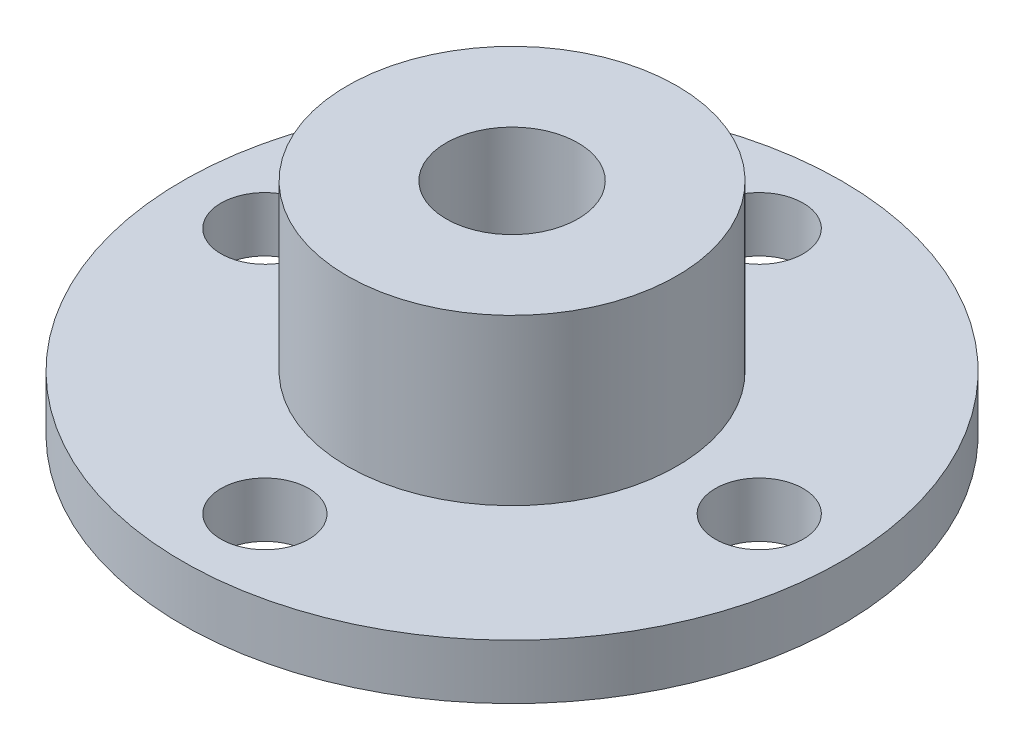
ISO-10303-21;
HEADER;
FILE_DESCRIPTION(('STEP AP214'),'2;1');
FILE_NAME('part.step','',(''),(''),'','','');
FILE_SCHEMA(('AUTOMOTIVE_DESIGN { 1 0 10303 214 1 1 1 1 }'));
ENDSEC;
DATA;
#1=APPLICATION_CONTEXT('core data for automotive mechanical design processes');
#2=APPLICATION_PROTOCOL_DEFINITION('international standard','automotive_design',2000,#1);
#3=PRODUCT_CONTEXT('',#1,'mechanical');
#4=PRODUCT('Part','Part','',(#3));
#5=PRODUCT_RELATED_PRODUCT_CATEGORY('part','',(#4));
#6=PRODUCT_DEFINITION_FORMATION('','',#4);
#7=PRODUCT_DEFINITION_CONTEXT('part definition',#1,'design');
#8=PRODUCT_DEFINITION('design','',#6,#7);
#9=PRODUCT_DEFINITION_SHAPE('','',#8);
#10=(LENGTH_UNIT() NAMED_UNIT(*) SI_UNIT(.MILLI.,.METRE.));
#11=(NAMED_UNIT(*) PLANE_ANGLE_UNIT() SI_UNIT($,.RADIAN.));
#12=(NAMED_UNIT(*) SI_UNIT($,.STERADIAN.) SOLID_ANGLE_UNIT());
#13=UNCERTAINTY_MEASURE_WITH_UNIT(LENGTH_MEASURE(1.E-05),#10,'distance_accuracy_value','');
#14=(GEOMETRIC_REPRESENTATION_CONTEXT(3) GLOBAL_UNCERTAINTY_ASSIGNED_CONTEXT((#13)) GLOBAL_UNIT_ASSIGNED_CONTEXT((#10,
#11,#12)) REPRESENTATION_CONTEXT('',''));
#15=CARTESIAN_POINT('',(0.,0.,0.));
#16=DIRECTION('',(0.,0.,1.));
#17=DIRECTION('',(1.,0.,0.));
#18=AXIS2_PLACEMENT_3D('',#15,#16,#17);
#19=CARTESIAN_POINT('',(0.,12.7,0.));
#20=DIRECTION('',(0.,-1.,0.));
#21=DIRECTION('',(0.,0.,-1.));
#22=AXIS2_PLACEMENT_3D('',#19,#20,#21);
#23=CYLINDRICAL_SURFACE('',#22,9.525);
#24=CARTESIAN_POINT('',(0.,12.7,0.));
#25=DIRECTION('',(0.,1.,0.));
#26=DIRECTION('',(0.,0.,1.));
#27=AXIS2_PLACEMENT_3D('',#24,#25,#26);
#28=CIRCLE('',#27,9.525);
#29=CARTESIAN_POINT('',(0.,12.7,9.525));
#30=VERTEX_POINT('',#29);
#31=EDGE_CURVE('E52',#30,#30,#28,.T.);
#32=ORIENTED_EDGE('',*,*,#31,.F.);
#33=EDGE_LOOP('',(#32));
#34=FACE_BOUND('',#33,.T.);
#35=CARTESIAN_POINT('',(0.,3.175,0.));
#36=DIRECTION('',(0.,-1.,0.));
#37=DIRECTION('',(0.,0.,-1.));
#38=AXIS2_PLACEMENT_3D('',#35,#36,#37);
#39=CIRCLE('',#38,9.525);
#40=CARTESIAN_POINT('',(0.,3.175,-9.525));
#41=VERTEX_POINT('',#40);
#42=EDGE_CURVE('E10',#41,#41,#39,.T.);
#43=ORIENTED_EDGE('',*,*,#42,.F.);
#44=EDGE_LOOP('',(#43));
#45=FACE_BOUND('',#44,.T.);
#46=ADVANCED_FACE('F45',(#34,#45),#23,.T.);
#47=CARTESIAN_POINT('',(0.,12.7,0.));
#48=DIRECTION('',(0.,1.,0.));
#49=DIRECTION('',(0.,0.,1.));
#50=AXIS2_PLACEMENT_3D('',#47,#48,#49);
#51=PLANE('',#50);
#52=ORIENTED_EDGE('',*,*,#31,.T.);
#53=EDGE_LOOP('',(#52));
#54=FACE_BOUND('',#53,.T.);
#55=CARTESIAN_POINT('',(0.,12.7,0.));
#56=DIRECTION('',(0.,1.,0.));
#57=DIRECTION('',(0.,0.,1.));
#58=AXIS2_PLACEMENT_3D('',#55,#56,#57);
#59=CIRCLE('',#58,3.81);
#60=CARTESIAN_POINT('',(0.,12.7,3.81));
#61=VERTEX_POINT('',#60);
#62=EDGE_CURVE('E57',#61,#61,#59,.T.);
#63=ORIENTED_EDGE('',*,*,#62,.F.);
#64=EDGE_LOOP('',(#63));
#65=FACE_BOUND('',#64,.T.);
#66=ADVANCED_FACE('F123',(#54,#65),#51,.T.);
#67=CARTESIAN_POINT('',(0.,0.,0.));
#68=DIRECTION('',(0.,1.,0.));
#69=DIRECTION('',(0.,0.,1.));
#70=AXIS2_PLACEMENT_3D('',#67,#68,#69);
#71=PLANE('',#70);
#72=CARTESIAN_POINT('',(0.,0.,0.));
#73=DIRECTION('',(0.,1.,0.));
#74=DIRECTION('',(0.,0.,1.));
#75=AXIS2_PLACEMENT_3D('',#72,#73,#74);
#76=CIRCLE('',#75,3.81);
#77=CARTESIAN_POINT('',(0.,0.,3.81));
#78=VERTEX_POINT('',#77);
#79=EDGE_CURVE('E62',#78,#78,#76,.T.);
#80=ORIENTED_EDGE('',*,*,#79,.T.);
#81=EDGE_LOOP('',(#80));
#82=FACE_BOUND('',#81,.T.);
#83=CARTESIAN_POINT('',(-14.2875,0.,0.));
#84=DIRECTION('',(0.,-1.,0.));
#85=DIRECTION('',(0.,0.,-1.));
#86=AXIS2_PLACEMENT_3D('',#83,#84,#85);
#87=CIRCLE('',#86,2.54);
#88=CARTESIAN_POINT('',(-14.2875,0.,-2.53999999999999));
#89=VERTEX_POINT('',#88);
#90=EDGE_CURVE('E101',#89,#89,#87,.T.);
#91=ORIENTED_EDGE('',*,*,#90,.F.);
#92=EDGE_LOOP('',(#91));
#93=FACE_BOUND('',#92,.T.);
#94=CARTESIAN_POINT('',(0.,0.,-14.2875));
#95=DIRECTION('',(0.,-1.,0.));
#96=DIRECTION('',(0.,0.,-1.));
#97=AXIS2_PLACEMENT_3D('',#94,#95,#96);
#98=CIRCLE('',#97,2.54);
#99=CARTESIAN_POINT('',(0.,0.,-16.8275));
#100=VERTEX_POINT('',#99);
#101=EDGE_CURVE('E93',#100,#100,#98,.T.);
#102=ORIENTED_EDGE('',*,*,#101,.F.);
#103=EDGE_LOOP('',(#102));
#104=FACE_BOUND('',#103,.T.);
#105=CARTESIAN_POINT('',(14.2875,0.,0.));
#106=DIRECTION('',(0.,-1.,0.));
#107=DIRECTION('',(0.,0.,-1.));
#108=AXIS2_PLACEMENT_3D('',#105,#106,#107);
#109=CIRCLE('',#108,2.54);
#110=CARTESIAN_POINT('',(14.2875,0.,-2.54));
#111=VERTEX_POINT('',#110);
#112=EDGE_CURVE('E85',#111,#111,#109,.T.);
#113=ORIENTED_EDGE('',*,*,#112,.F.);
#114=EDGE_LOOP('',(#113));
#115=FACE_BOUND('',#114,.T.);
#116=CARTESIAN_POINT('',(0.,0.,14.2875));
#117=DIRECTION('',(0.,-1.,0.));
#118=DIRECTION('',(0.,0.,-1.));
#119=AXIS2_PLACEMENT_3D('',#116,#117,#118);
#120=CIRCLE('',#119,2.54);
#121=CARTESIAN_POINT('',(0.,0.,11.7475));
#122=VERTEX_POINT('',#121);
#123=EDGE_CURVE('E77',#122,#122,#120,.T.);
#124=ORIENTED_EDGE('',*,*,#123,.F.);
#125=EDGE_LOOP('',(#124));
#126=FACE_BOUND('',#125,.T.);
#127=CARTESIAN_POINT('',(0.,0.,0.));
#128=DIRECTION('',(0.,-1.,0.));
#129=DIRECTION('',(0.,0.,-1.));
#130=AXIS2_PLACEMENT_3D('',#127,#128,#129);
#131=CIRCLE('',#130,19.05);
#132=CARTESIAN_POINT('',(0.,0.,-19.05));
#133=VERTEX_POINT('',#132);
#134=EDGE_CURVE('E69',#133,#133,#131,.T.);
#135=ORIENTED_EDGE('',*,*,#134,.T.);
#136=EDGE_LOOP('',(#135));
#137=FACE_BOUND('',#136,.T.);
#138=ADVANCED_FACE('F119',(#82,#93,#104,#115,#126,#137),#71,.F.);
#139=CARTESIAN_POINT('',(0.,12.7,0.));
#140=DIRECTION('',(0.,-1.,0.));
#141=DIRECTION('',(0.,0.,-1.));
#142=AXIS2_PLACEMENT_3D('',#139,#140,#141);
#143=CYLINDRICAL_SURFACE('',#142,3.81);
#144=ORIENTED_EDGE('',*,*,#62,.T.);
#145=EDGE_LOOP('',(#144));
#146=FACE_BOUND('',#145,.T.);
#147=ORIENTED_EDGE('',*,*,#79,.F.);
#148=EDGE_LOOP('',(#147));
#149=FACE_BOUND('',#148,.T.);
#150=ADVANCED_FACE('F122',(#146,#149),#143,.F.);
#151=CARTESIAN_POINT('',(0.,3.175,0.));
#152=DIRECTION('',(0.,-1.,0.));
#153=DIRECTION('',(0.,0.,-1.));
#154=AXIS2_PLACEMENT_3D('',#151,#152,#153);
#155=CYLINDRICAL_SURFACE('',#154,19.05);
#156=CARTESIAN_POINT('',(0.,3.175,0.));
#157=DIRECTION('',(0.,-1.,0.));
#158=DIRECTION('',(0.,0.,-1.));
#159=AXIS2_PLACEMENT_3D('',#156,#157,#158);
#160=CIRCLE('',#159,19.05);
#161=CARTESIAN_POINT('',(0.,3.175,-19.05));
#162=VERTEX_POINT('',#161);
#163=EDGE_CURVE('E67',#162,#162,#160,.T.);
#164=ORIENTED_EDGE('',*,*,#163,.T.);
#165=EDGE_LOOP('',(#164));
#166=FACE_BOUND('',#165,.T.);
#167=ORIENTED_EDGE('',*,*,#134,.F.);
#168=EDGE_LOOP('',(#167));
#169=FACE_BOUND('',#168,.T.);
#170=ADVANCED_FACE('F133',(#166,#169),#155,.T.);
#171=CARTESIAN_POINT('',(0.,3.175,0.));
#172=DIRECTION('',(0.,-1.,0.));
#173=DIRECTION('',(0.,0.,-1.));
#174=AXIS2_PLACEMENT_3D('',#171,#172,#173);
#175=PLANE('',#174);
#176=CARTESIAN_POINT('',(-14.2875,3.175,0.));
#177=DIRECTION('',(0.,-1.,0.));
#178=DIRECTION('',(0.,0.,-1.));
#179=AXIS2_PLACEMENT_3D('',#176,#177,#178);
#180=CIRCLE('',#179,2.54);
#181=CARTESIAN_POINT('',(-14.2875,3.175,-2.53999999999999));
#182=VERTEX_POINT('',#181);
#183=EDGE_CURVE('E97',#182,#182,#180,.T.);
#184=ORIENTED_EDGE('',*,*,#183,.T.);
#185=EDGE_LOOP('',(#184));
#186=FACE_BOUND('',#185,.T.);
#187=CARTESIAN_POINT('',(0.,3.175,-14.2875));
#188=DIRECTION('',(0.,-1.,0.));
#189=DIRECTION('',(0.,0.,-1.));
#190=AXIS2_PLACEMENT_3D('',#187,#188,#189);
#191=CIRCLE('',#190,2.54);
#192=CARTESIAN_POINT('',(0.,3.175,-16.8275));
#193=VERTEX_POINT('',#192);
#194=EDGE_CURVE('E89',#193,#193,#191,.T.);
#195=ORIENTED_EDGE('',*,*,#194,.T.);
#196=EDGE_LOOP('',(#195));
#197=FACE_BOUND('',#196,.T.);
#198=CARTESIAN_POINT('',(14.2875,3.175,0.));
#199=DIRECTION('',(0.,-1.,0.));
#200=DIRECTION('',(0.,0.,-1.));
#201=AXIS2_PLACEMENT_3D('',#198,#199,#200);
#202=CIRCLE('',#201,2.54);
#203=CARTESIAN_POINT('',(14.2875,3.175,-2.54));
#204=VERTEX_POINT('',#203);
#205=EDGE_CURVE('E81',#204,#204,#202,.T.);
#206=ORIENTED_EDGE('',*,*,#205,.T.);
#207=EDGE_LOOP('',(#206));
#208=FACE_BOUND('',#207,.T.);
#209=ORIENTED_EDGE('',*,*,#42,.T.);
#210=EDGE_LOOP('',(#209));
#211=FACE_BOUND('',#210,.T.);
#212=CARTESIAN_POINT('',(0.,3.175,14.2875));
#213=DIRECTION('',(0.,-1.,0.));
#214=DIRECTION('',(0.,0.,-1.));
#215=AXIS2_PLACEMENT_3D('',#212,#213,#214);
#216=CIRCLE('',#215,2.54);
#217=CARTESIAN_POINT('',(0.,3.175,11.7475));
#218=VERTEX_POINT('',#217);
#219=EDGE_CURVE('E73',#218,#218,#216,.T.);
#220=ORIENTED_EDGE('',*,*,#219,.T.);
#221=EDGE_LOOP('',(#220));
#222=FACE_BOUND('',#221,.T.);
#223=ORIENTED_EDGE('',*,*,#163,.F.);
#224=EDGE_LOOP('',(#223));
#225=FACE_BOUND('',#224,.T.);
#226=ADVANCED_FACE('F109',(#186,#197,#208,#211,#222,#225),#175,.F.);
#227=CARTESIAN_POINT('',(0.,3.175,14.2875));
#228=DIRECTION('',(0.,-1.,0.));
#229=DIRECTION('',(0.,0.,-1.));
#230=AXIS2_PLACEMENT_3D('',#227,#228,#229);
#231=CYLINDRICAL_SURFACE('',#230,2.54);
#232=ORIENTED_EDGE('',*,*,#219,.F.);
#233=EDGE_LOOP('',(#232));
#234=FACE_BOUND('',#233,.T.);
#235=ORIENTED_EDGE('',*,*,#123,.T.);
#236=EDGE_LOOP('',(#235));
#237=FACE_BOUND('',#236,.T.);
#238=ADVANCED_FACE('F141',(#234,#237),#231,.F.);
#239=CARTESIAN_POINT('',(14.2875,3.175,0.));
#240=DIRECTION('',(0.,-1.,0.));
#241=DIRECTION('',(0.,0.,-1.));
#242=AXIS2_PLACEMENT_3D('',#239,#240,#241);
#243=CYLINDRICAL_SURFACE('',#242,2.54);
#244=ORIENTED_EDGE('',*,*,#205,.F.);
#245=EDGE_LOOP('',(#244));
#246=FACE_BOUND('',#245,.T.);
#247=ORIENTED_EDGE('',*,*,#112,.T.);
#248=EDGE_LOOP('',(#247));
#249=FACE_BOUND('',#248,.T.);
#250=ADVANCED_FACE('F196',(#246,#249),#243,.F.);
#251=CARTESIAN_POINT('',(0.,3.175,-14.2875));
#252=DIRECTION('',(0.,-1.,0.));
#253=DIRECTION('',(0.,0.,-1.));
#254=AXIS2_PLACEMENT_3D('',#251,#252,#253);
#255=CYLINDRICAL_SURFACE('',#254,2.54);
#256=ORIENTED_EDGE('',*,*,#194,.F.);
#257=EDGE_LOOP('',(#256));
#258=FACE_BOUND('',#257,.T.);
#259=ORIENTED_EDGE('',*,*,#101,.T.);
#260=EDGE_LOOP('',(#259));
#261=FACE_BOUND('',#260,.T.);
#262=ADVANCED_FACE('F115',(#258,#261),#255,.F.);
#263=CARTESIAN_POINT('',(-14.2875,3.175,0.));
#264=DIRECTION('',(0.,-1.,0.));
#265=DIRECTION('',(0.,0.,-1.));
#266=AXIS2_PLACEMENT_3D('',#263,#264,#265);
#267=CYLINDRICAL_SURFACE('',#266,2.54);
#268=ORIENTED_EDGE('',*,*,#183,.F.);
#269=EDGE_LOOP('',(#268));
#270=FACE_BOUND('',#269,.T.);
#271=ORIENTED_EDGE('',*,*,#90,.T.);
#272=EDGE_LOOP('',(#271));
#273=FACE_BOUND('',#272,.T.);
#274=ADVANCED_FACE('F112',(#270,#273),#267,.F.);
#275=CLOSED_SHELL('',(#46,#66,#138,#150,#170,#226,#238,#250,#262,#274));
#276=MANIFOLD_SOLID_BREP('B2',#275);
#277=ADVANCED_BREP_SHAPE_REPRESENTATION('',(#18,#276),#14);
#278=SHAPE_DEFINITION_REPRESENTATION(#9,#277);
ENDSEC;
END-ISO-10303-21;
